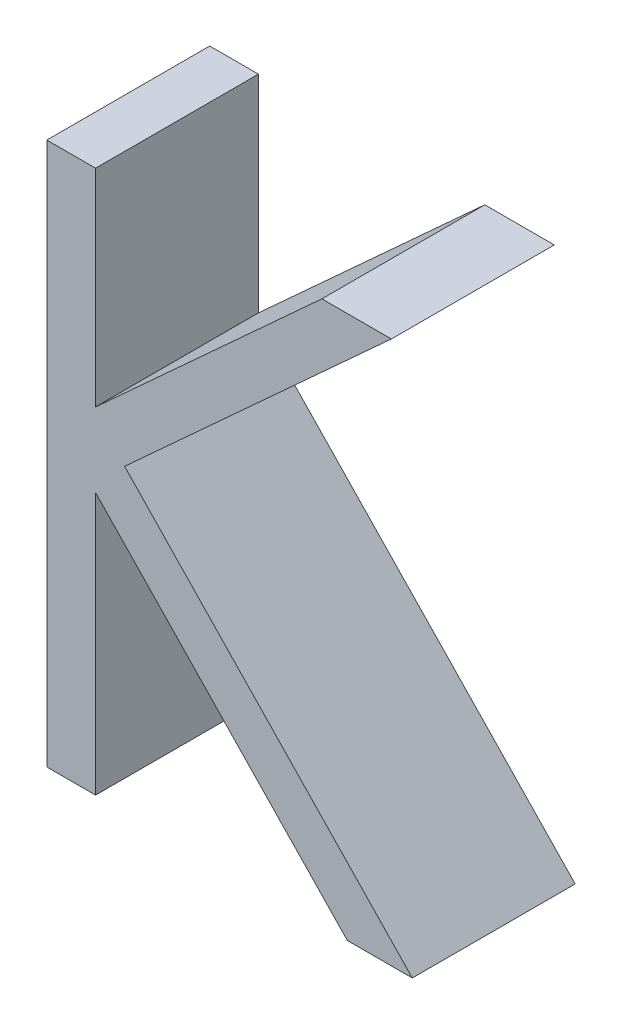
ISO-10303-21;
HEADER;
FILE_DESCRIPTION(('STEP AP214'),'2;1');
FILE_NAME('part.step','',(''),(''),'','','');
FILE_SCHEMA(('AUTOMOTIVE_DESIGN { 1 0 10303 214 1 1 1 1 }'));
ENDSEC;
DATA;
#1=APPLICATION_CONTEXT('core data for automotive mechanical design processes');
#2=APPLICATION_PROTOCOL_DEFINITION('international standard','automotive_design',2000,#1);
#3=PRODUCT_CONTEXT('',#1,'mechanical');
#4=PRODUCT('Part','Part','',(#3));
#5=PRODUCT_RELATED_PRODUCT_CATEGORY('part','',(#4));
#6=PRODUCT_DEFINITION_FORMATION('','',#4);
#7=PRODUCT_DEFINITION_CONTEXT('part definition',#1,'design');
#8=PRODUCT_DEFINITION('design','',#6,#7);
#9=PRODUCT_DEFINITION_SHAPE('','',#8);
#10=(LENGTH_UNIT() NAMED_UNIT(*) SI_UNIT(.MILLI.,.METRE.));
#11=(NAMED_UNIT(*) PLANE_ANGLE_UNIT() SI_UNIT($,.RADIAN.));
#12=(NAMED_UNIT(*) SI_UNIT($,.STERADIAN.) SOLID_ANGLE_UNIT());
#13=UNCERTAINTY_MEASURE_WITH_UNIT(LENGTH_MEASURE(1.E-05),#10,'distance_accuracy_value','');
#14=(GEOMETRIC_REPRESENTATION_CONTEXT(3) GLOBAL_UNCERTAINTY_ASSIGNED_CONTEXT((#13)) GLOBAL_UNIT_ASSIGNED_CONTEXT((#10,
#11,#12)) REPRESENTATION_CONTEXT('',''));
#15=CARTESIAN_POINT('',(0.,0.,0.));
#16=DIRECTION('',(0.,0.,1.));
#17=DIRECTION('',(1.,0.,0.));
#18=AXIS2_PLACEMENT_3D('',#15,#16,#17);
#19=CARTESIAN_POINT('',(-55.4324653258695,-22.8701190762308,1.5));
#20=DIRECTION('',(-1.,0.,0.));
#21=DIRECTION('',(0.,0.,1.));
#22=AXIS2_PLACEMENT_3D('',#19,#20,#21);
#23=PLANE('',#22);
#24=DIRECTION('',(0.,1.,0.));
#25=VECTOR('',#24,1.);
#26=CARTESIAN_POINT('',(-55.4324653258695,-22.8701190762308,0.));
#27=LINE('',#26,#25);
#28=CARTESIAN_POINT('',(-55.4324653258695,-22.8701190762308,0.));
#29=VERTEX_POINT('',#28);
#30=CARTESIAN_POINT('',(-55.4324653258695,-17.8701190762308,0.));
#31=VERTEX_POINT('',#30);
#32=EDGE_CURVE('E148',#29,#31,#27,.T.);
#33=ORIENTED_EDGE('',*,*,#32,.F.);
#34=DIRECTION('',(0.,0.,-1.));
#35=VECTOR('',#34,1.);
#36=CARTESIAN_POINT('',(-55.4324653258695,-22.8701190762308,1.5));
#37=LINE('',#36,#35);
#38=CARTESIAN_POINT('',(-55.4324653258695,-22.8701190762308,1.5));
#39=VERTEX_POINT('',#38);
#40=EDGE_CURVE('E11',#39,#29,#37,.T.);
#41=ORIENTED_EDGE('',*,*,#40,.F.);
#42=DIRECTION('',(0.,1.,0.));
#43=VECTOR('',#42,1.);
#44=CARTESIAN_POINT('',(-55.4324653258695,-22.8701190762308,1.5));
#45=LINE('',#44,#43);
#46=CARTESIAN_POINT('',(-55.4324653258695,-17.8701190762308,1.5));
#47=VERTEX_POINT('',#46);
#48=EDGE_CURVE('E177',#39,#47,#45,.T.);
#49=ORIENTED_EDGE('',*,*,#48,.T.);
#50=DIRECTION('',(0.,0.,-1.));
#51=VECTOR('',#50,1.);
#52=CARTESIAN_POINT('',(-55.4324653258695,-17.8701190762308,1.5));
#53=LINE('',#52,#51);
#54=EDGE_CURVE('E36',#47,#31,#53,.T.);
#55=ORIENTED_EDGE('',*,*,#54,.T.);
#56=EDGE_LOOP('',(#33,#41,#49,#55));
#57=FACE_BOUND('',#56,.T.);
#58=ADVANCED_FACE('F33',(#57),#23,.T.);
#59=CARTESIAN_POINT('',(-54.9837473771516,-22.8701190762308,1.5));
#60=DIRECTION('',(0.,-1.,0.));
#61=DIRECTION('',(0.,0.,-1.));
#62=AXIS2_PLACEMENT_3D('',#59,#60,#61);
#63=PLANE('',#62);
#64=DIRECTION('',(-1.,0.,0.));
#65=VECTOR('',#64,1.);
#66=CARTESIAN_POINT('',(-54.9837473771516,-22.8701190762308,0.));
#67=LINE('',#66,#65);
#68=CARTESIAN_POINT('',(-54.9837473771516,-22.8701190762308,0.));
#69=VERTEX_POINT('',#68);
#70=EDGE_CURVE('E175',#69,#29,#67,.T.);
#71=ORIENTED_EDGE('',*,*,#70,.F.);
#72=DIRECTION('',(0.,0.,-1.));
#73=VECTOR('',#72,1.);
#74=CARTESIAN_POINT('',(-54.9837473771516,-22.8701190762308,1.5));
#75=LINE('',#74,#73);
#76=CARTESIAN_POINT('',(-54.9837473771516,-22.8701190762308,1.5));
#77=VERTEX_POINT('',#76);
#78=EDGE_CURVE('E42',#77,#69,#75,.T.);
#79=ORIENTED_EDGE('',*,*,#78,.F.);
#80=DIRECTION('',(-1.,0.,0.));
#81=VECTOR('',#80,1.);
#82=CARTESIAN_POINT('',(-54.9837473771516,-22.8701190762308,1.5));
#83=LINE('',#82,#81);
#84=EDGE_CURVE('E138',#77,#39,#83,.T.);
#85=ORIENTED_EDGE('',*,*,#84,.T.);
#86=ORIENTED_EDGE('',*,*,#40,.T.);
#87=EDGE_LOOP('',(#71,#79,#85,#86));
#88=FACE_BOUND('',#87,.T.);
#89=ADVANCED_FACE('F195',(#88),#63,.T.);
#90=CARTESIAN_POINT('',(-54.9837473771516,-20.4572584993077,1.5));
#91=DIRECTION('',(1.,0.,0.));
#92=DIRECTION('',(0.,0.,-1.));
#93=AXIS2_PLACEMENT_3D('',#90,#91,#92);
#94=PLANE('',#93);
#95=DIRECTION('',(0.,-1.,0.));
#96=VECTOR('',#95,1.);
#97=CARTESIAN_POINT('',(-54.9837473771516,-20.4572584993077,0.));
#98=LINE('',#97,#96);
#99=CARTESIAN_POINT('',(-54.9837473771516,-20.4572584993077,0.));
#100=VERTEX_POINT('',#99);
#101=EDGE_CURVE('E125',#100,#69,#98,.T.);
#102=ORIENTED_EDGE('',*,*,#101,.F.);
#103=DIRECTION('',(0.,0.,-1.));
#104=VECTOR('',#103,1.);
#105=CARTESIAN_POINT('',(-54.9837473771516,-20.4572584993077,1.5));
#106=LINE('',#105,#104);
#107=CARTESIAN_POINT('',(-54.9837473771516,-20.4572584993077,1.5));
#108=VERTEX_POINT('',#107);
#109=EDGE_CURVE('E120',#108,#100,#106,.T.);
#110=ORIENTED_EDGE('',*,*,#109,.F.);
#111=DIRECTION('',(0.,-1.,0.));
#112=VECTOR('',#111,1.);
#113=CARTESIAN_POINT('',(-54.9837473771516,-20.4572584993077,1.5));
#114=LINE('',#113,#112);
#115=EDGE_CURVE('E123',#108,#77,#114,.T.);
#116=ORIENTED_EDGE('',*,*,#115,.T.);
#117=ORIENTED_EDGE('',*,*,#78,.T.);
#118=EDGE_LOOP('',(#102,#110,#116,#117));
#119=FACE_BOUND('',#118,.T.);
#120=ADVANCED_FACE('F122',(#119),#94,.T.);
#121=CARTESIAN_POINT('',(-52.6650374412542,-22.8701190762308,1.5));
#122=DIRECTION('',(-0.721034337340712,-0.692899332064651,0.));
#123=DIRECTION('',(0.692899332064651,-0.721034337340712,0.));
#124=AXIS2_PLACEMENT_3D('',#121,#122,#123);
#125=PLANE('',#124);
#126=DIRECTION('',(-0.692899332064651,0.721034337340712,0.));
#127=VECTOR('',#126,1.);
#128=CARTESIAN_POINT('',(-52.6650374412542,-22.8701190762308,0.));
#129=LINE('',#128,#127);
#130=CARTESIAN_POINT('',(-52.6650374412542,-22.8701190762308,0.));
#131=VERTEX_POINT('',#130);
#132=EDGE_CURVE('E172',#131,#100,#129,.T.);
#133=ORIENTED_EDGE('',*,*,#132,.F.);
#134=DIRECTION('',(0.,0.,-1.));
#135=VECTOR('',#134,1.);
#136=CARTESIAN_POINT('',(-52.6650374412542,-22.8701190762308,1.5));
#137=LINE('',#136,#135);
#138=CARTESIAN_POINT('',(-52.6650374412542,-22.8701190762308,1.5));
#139=VERTEX_POINT('',#138);
#140=EDGE_CURVE('E130',#139,#131,#137,.T.);
#141=ORIENTED_EDGE('',*,*,#140,.F.);
#142=DIRECTION('',(-0.692899332064651,0.721034337340712,0.));
#143=VECTOR('',#142,1.);
#144=CARTESIAN_POINT('',(-52.6650374412542,-22.8701190762308,1.5));
#145=LINE('',#144,#143);
#146=EDGE_CURVE('E136',#139,#108,#145,.T.);
#147=ORIENTED_EDGE('',*,*,#146,.T.);
#148=ORIENTED_EDGE('',*,*,#109,.T.);
#149=EDGE_LOOP('',(#133,#141,#147,#148));
#150=FACE_BOUND('',#149,.T.);
#151=ADVANCED_FACE('F140',(#150),#125,.T.);
#152=CARTESIAN_POINT('',(-52.0670807104849,-22.8701190762308,1.5));
#153=DIRECTION('',(0.,-1.,0.));
#154=DIRECTION('',(0.,0.,-1.));
#155=AXIS2_PLACEMENT_3D('',#152,#153,#154);
#156=PLANE('',#155);
#157=DIRECTION('',(-1.,0.,0.));
#158=VECTOR('',#157,1.);
#159=CARTESIAN_POINT('',(-52.0670807104849,-22.8701190762308,0.));
#160=LINE('',#159,#158);
#161=CARTESIAN_POINT('',(-52.0670807104849,-22.8701190762308,0.));
#162=VERTEX_POINT('',#161);
#163=EDGE_CURVE('E169',#162,#131,#160,.T.);
#164=ORIENTED_EDGE('',*,*,#163,.F.);
#165=DIRECTION('',(0.,0.,-1.));
#166=VECTOR('',#165,1.);
#167=CARTESIAN_POINT('',(-52.0670807104849,-22.8701190762308,1.5));
#168=LINE('',#167,#166);
#169=CARTESIAN_POINT('',(-52.0670807104849,-22.8701190762308,1.5));
#170=VERTEX_POINT('',#169);
#171=EDGE_CURVE('E181',#170,#162,#168,.T.);
#172=ORIENTED_EDGE('',*,*,#171,.F.);
#173=DIRECTION('',(-1.,0.,0.));
#174=VECTOR('',#173,1.);
#175=CARTESIAN_POINT('',(-52.0670807104849,-22.8701190762308,1.5));
#176=LINE('',#175,#174);
#177=EDGE_CURVE('E141',#170,#139,#176,.T.);
#178=ORIENTED_EDGE('',*,*,#177,.T.);
#179=ORIENTED_EDGE('',*,*,#140,.T.);
#180=EDGE_LOOP('',(#164,#172,#178,#179));
#181=FACE_BOUND('',#180,.T.);
#182=ADVANCED_FACE('F208',(#181),#156,.T.);
#183=CARTESIAN_POINT('',(-54.7163194925362,-20.1137088198206,1.5));
#184=DIRECTION('',(0.720984077089344,0.692951629324607,0.));
#185=DIRECTION('',(-0.692951629324607,0.720984077089344,0.));
#186=AXIS2_PLACEMENT_3D('',#183,#184,#185);
#187=PLANE('',#186);
#188=DIRECTION('',(0.692951629324606,-0.720984077089344,0.));
#189=VECTOR('',#188,1.);
#190=CARTESIAN_POINT('',(-54.7163194925362,-20.1137088198206,0.));
#191=LINE('',#190,#189);
#192=CARTESIAN_POINT('',(-54.7163194925362,-20.1137088198206,0.));
#193=VERTEX_POINT('',#192);
#194=EDGE_CURVE('E166',#193,#162,#191,.T.);
#195=ORIENTED_EDGE('',*,*,#194,.F.);
#196=DIRECTION('',(0.,0.,-1.));
#197=VECTOR('',#196,1.);
#198=CARTESIAN_POINT('',(-54.7163194925362,-20.1137088198206,1.5));
#199=LINE('',#198,#197);
#200=CARTESIAN_POINT('',(-54.7163194925362,-20.1137088198206,1.5));
#201=VERTEX_POINT('',#200);
#202=EDGE_CURVE('E183',#201,#193,#199,.T.);
#203=ORIENTED_EDGE('',*,*,#202,.F.);
#204=DIRECTION('',(0.692951629324606,-0.720984077089344,0.));
#205=VECTOR('',#204,1.);
#206=CARTESIAN_POINT('',(-54.7163194925362,-20.1137088198206,1.5));
#207=LINE('',#206,#205);
#208=EDGE_CURVE('E143',#201,#170,#207,.T.);
#209=ORIENTED_EDGE('',*,*,#208,.T.);
#210=ORIENTED_EDGE('',*,*,#171,.T.);
#211=EDGE_LOOP('',(#195,#203,#209,#210));
#212=FACE_BOUND('',#211,.T.);
#213=ADVANCED_FACE('F211',(#212),#187,.T.);
#214=CARTESIAN_POINT('',(-52.2593884027926,-17.8701190762308,1.5));
#215=DIRECTION('',(0.674319328149855,-0.738439871406961,0.));
#216=DIRECTION('',(0.738439871406961,0.674319328149855,0.));
#217=AXIS2_PLACEMENT_3D('',#214,#215,#216);
#218=PLANE('',#217);
#219=DIRECTION('',(-0.738439871406961,-0.674319328149855,0.));
#220=VECTOR('',#219,1.);
#221=CARTESIAN_POINT('',(-52.2593884027926,-17.8701190762308,0.));
#222=LINE('',#221,#220);
#223=CARTESIAN_POINT('',(-52.2593884027926,-17.8701190762308,0.));
#224=VERTEX_POINT('',#223);
#225=EDGE_CURVE('E163',#224,#193,#222,.T.);
#226=ORIENTED_EDGE('',*,*,#225,.F.);
#227=DIRECTION('',(0.,0.,-1.));
#228=VECTOR('',#227,1.);
#229=CARTESIAN_POINT('',(-52.2593884027926,-17.8701190762308,1.5));
#230=LINE('',#229,#228);
#231=CARTESIAN_POINT('',(-52.2593884027926,-17.8701190762308,1.5));
#232=VERTEX_POINT('',#231);
#233=EDGE_CURVE('E185',#232,#224,#230,.T.);
#234=ORIENTED_EDGE('',*,*,#233,.F.);
#235=DIRECTION('',(-0.738439871406961,-0.674319328149855,0.));
#236=VECTOR('',#235,1.);
#237=CARTESIAN_POINT('',(-52.2593884027926,-17.8701190762308,1.5));
#238=LINE('',#237,#236);
#239=EDGE_CURVE('E345',#232,#201,#238,.T.);
#240=ORIENTED_EDGE('',*,*,#239,.T.);
#241=ORIENTED_EDGE('',*,*,#202,.T.);
#242=EDGE_LOOP('',(#226,#234,#240,#241));
#243=FACE_BOUND('',#242,.T.);
#244=ADVANCED_FACE('F215',(#243),#218,.T.);
#245=CARTESIAN_POINT('',(-52.8994124412541,-17.8701190762308,1.5));
#246=DIRECTION('',(0.,1.,0.));
#247=DIRECTION('',(0.,0.,1.));
#248=AXIS2_PLACEMENT_3D('',#245,#246,#247);
#249=PLANE('',#248);
#250=DIRECTION('',(1.,0.,0.));
#251=VECTOR('',#250,1.);
#252=CARTESIAN_POINT('',(-52.8994124412541,-17.8701190762308,0.));
#253=LINE('',#252,#251);
#254=CARTESIAN_POINT('',(-52.8994124412541,-17.8701190762308,0.));
#255=VERTEX_POINT('',#254);
#256=EDGE_CURVE('E160',#255,#224,#253,.T.);
#257=ORIENTED_EDGE('',*,*,#256,.F.);
#258=DIRECTION('',(0.,0.,-1.));
#259=VECTOR('',#258,1.);
#260=CARTESIAN_POINT('',(-52.8994124412541,-17.8701190762308,1.5));
#261=LINE('',#260,#259);
#262=CARTESIAN_POINT('',(-52.8994124412541,-17.8701190762308,1.5));
#263=VERTEX_POINT('',#262);
#264=EDGE_CURVE('E187',#263,#255,#261,.T.);
#265=ORIENTED_EDGE('',*,*,#264,.F.);
#266=DIRECTION('',(1.,0.,0.));
#267=VECTOR('',#266,1.);
#268=CARTESIAN_POINT('',(-52.8994124412541,-17.8701190762308,1.5));
#269=LINE('',#268,#267);
#270=EDGE_CURVE('E338',#263,#232,#269,.T.);
#271=ORIENTED_EDGE('',*,*,#270,.T.);
#272=ORIENTED_EDGE('',*,*,#233,.T.);
#273=EDGE_LOOP('',(#257,#265,#271,#272));
#274=FACE_BOUND('',#273,.T.);
#275=ADVANCED_FACE('F219',(#274),#249,.T.);
#276=CARTESIAN_POINT('',(-54.9837473771516,-19.7741655505898,1.5));
#277=DIRECTION('',(-0.67445441849086,0.738316488626765,0.));
#278=DIRECTION('',(-0.738316488626765,-0.67445441849086,0.));
#279=AXIS2_PLACEMENT_3D('',#276,#277,#278);
#280=PLANE('',#279);
#281=DIRECTION('',(0.738316488626765,0.67445441849086,0.));
#282=VECTOR('',#281,1.);
#283=CARTESIAN_POINT('',(-54.9837473771516,-19.7741655505898,0.));
#284=LINE('',#283,#282);
#285=CARTESIAN_POINT('',(-54.9837473771516,-19.7741655505898,0.));
#286=VERTEX_POINT('',#285);
#287=EDGE_CURVE('E157',#286,#255,#284,.T.);
#288=ORIENTED_EDGE('',*,*,#287,.F.);
#289=DIRECTION('',(0.,0.,-1.));
#290=VECTOR('',#289,1.);
#291=CARTESIAN_POINT('',(-54.9837473771516,-19.7741655505898,1.5));
#292=LINE('',#291,#290);
#293=CARTESIAN_POINT('',(-54.9837473771516,-19.7741655505898,1.5));
#294=VERTEX_POINT('',#293);
#295=EDGE_CURVE('E189',#294,#286,#292,.T.);
#296=ORIENTED_EDGE('',*,*,#295,.F.);
#297=DIRECTION('',(0.738316488626765,0.67445441849086,0.));
#298=VECTOR('',#297,1.);
#299=CARTESIAN_POINT('',(-54.9837473771516,-19.7741655505898,1.5));
#300=LINE('',#299,#298);
#301=EDGE_CURVE('E334',#294,#263,#300,.T.);
#302=ORIENTED_EDGE('',*,*,#301,.T.);
#303=ORIENTED_EDGE('',*,*,#264,.T.);
#304=EDGE_LOOP('',(#288,#296,#302,#303));
#305=FACE_BOUND('',#304,.T.);
#306=ADVANCED_FACE('F223',(#305),#280,.T.);
#307=CARTESIAN_POINT('',(-54.9837473771516,-17.8701190762308,1.5));
#308=DIRECTION('',(1.,0.,0.));
#309=DIRECTION('',(0.,0.,-1.));
#310=AXIS2_PLACEMENT_3D('',#307,#308,#309);
#311=PLANE('',#310);
#312=DIRECTION('',(0.,-1.,0.));
#313=VECTOR('',#312,1.);
#314=CARTESIAN_POINT('',(-54.9837473771516,-17.8701190762308,0.));
#315=LINE('',#314,#313);
#316=CARTESIAN_POINT('',(-54.9837473771516,-17.8701190762308,0.));
#317=VERTEX_POINT('',#316);
#318=EDGE_CURVE('E154',#317,#286,#315,.T.);
#319=ORIENTED_EDGE('',*,*,#318,.F.);
#320=DIRECTION('',(0.,0.,-1.));
#321=VECTOR('',#320,1.);
#322=CARTESIAN_POINT('',(-54.9837473771516,-17.8701190762308,1.5));
#323=LINE('',#322,#321);
#324=CARTESIAN_POINT('',(-54.9837473771516,-17.8701190762308,1.5));
#325=VERTEX_POINT('',#324);
#326=EDGE_CURVE('E190',#325,#317,#323,.T.);
#327=ORIENTED_EDGE('',*,*,#326,.F.);
#328=DIRECTION('',(0.,-1.,0.));
#329=VECTOR('',#328,1.);
#330=CARTESIAN_POINT('',(-54.9837473771516,-17.8701190762308,1.5));
#331=LINE('',#330,#329);
#332=EDGE_CURVE('E350',#325,#294,#331,.T.);
#333=ORIENTED_EDGE('',*,*,#332,.T.);
#334=ORIENTED_EDGE('',*,*,#295,.T.);
#335=EDGE_LOOP('',(#319,#327,#333,#334));
#336=FACE_BOUND('',#335,.T.);
#337=ADVANCED_FACE('F227',(#336),#311,.T.);
#338=CARTESIAN_POINT('',(-55.4324653258695,-17.8701190762308,1.5));
#339=DIRECTION('',(0.,1.,0.));
#340=DIRECTION('',(0.,0.,1.));
#341=AXIS2_PLACEMENT_3D('',#338,#339,#340);
#342=PLANE('',#341);
#343=DIRECTION('',(1.,0.,0.));
#344=VECTOR('',#343,1.);
#345=CARTESIAN_POINT('',(-55.4324653258695,-17.8701190762308,0.));
#346=LINE('',#345,#344);
#347=EDGE_CURVE('E151',#31,#317,#346,.T.);
#348=ORIENTED_EDGE('',*,*,#347,.F.);
#349=ORIENTED_EDGE('',*,*,#54,.F.);
#350=DIRECTION('',(1.,0.,0.));
#351=VECTOR('',#350,1.);
#352=CARTESIAN_POINT('',(-55.4324653258695,-17.8701190762308,1.5));
#353=LINE('',#352,#351);
#354=EDGE_CURVE('E352',#47,#325,#353,.T.);
#355=ORIENTED_EDGE('',*,*,#354,.T.);
#356=ORIENTED_EDGE('',*,*,#326,.T.);
#357=EDGE_LOOP('',(#348,#349,#355,#356));
#358=FACE_BOUND('',#357,.T.);
#359=ADVANCED_FACE('F192',(#358),#342,.T.);
#360=CARTESIAN_POINT('',(0.,0.,1.5));
#361=DIRECTION('',(0.,0.,-1.));
#362=DIRECTION('',(-1.,0.,0.));
#363=AXIS2_PLACEMENT_3D('',#360,#361,#362);
#364=PLANE('',#363);
#365=ORIENTED_EDGE('',*,*,#48,.F.);
#366=ORIENTED_EDGE('',*,*,#84,.F.);
#367=ORIENTED_EDGE('',*,*,#115,.F.);
#368=ORIENTED_EDGE('',*,*,#146,.F.);
#369=ORIENTED_EDGE('',*,*,#177,.F.);
#370=ORIENTED_EDGE('',*,*,#208,.F.);
#371=ORIENTED_EDGE('',*,*,#239,.F.);
#372=ORIENTED_EDGE('',*,*,#270,.F.);
#373=ORIENTED_EDGE('',*,*,#301,.F.);
#374=ORIENTED_EDGE('',*,*,#332,.F.);
#375=ORIENTED_EDGE('',*,*,#354,.F.);
#376=EDGE_LOOP('',(#365,#366,#367,#368,#369,#370,#371,#372,#373,#374,#375));
#377=FACE_BOUND('',#376,.T.);
#378=ADVANCED_FACE('F134',(#377),#364,.F.);
#379=CARTESIAN_POINT('',(0.,0.,0.));
#380=DIRECTION('',(0.,0.,-1.));
#381=DIRECTION('',(-1.,0.,0.));
#382=AXIS2_PLACEMENT_3D('',#379,#380,#381);
#383=PLANE('',#382);
#384=ORIENTED_EDGE('',*,*,#32,.T.);
#385=ORIENTED_EDGE('',*,*,#347,.T.);
#386=ORIENTED_EDGE('',*,*,#318,.T.);
#387=ORIENTED_EDGE('',*,*,#287,.T.);
#388=ORIENTED_EDGE('',*,*,#256,.T.);
#389=ORIENTED_EDGE('',*,*,#225,.T.);
#390=ORIENTED_EDGE('',*,*,#194,.T.);
#391=ORIENTED_EDGE('',*,*,#163,.T.);
#392=ORIENTED_EDGE('',*,*,#132,.T.);
#393=ORIENTED_EDGE('',*,*,#101,.T.);
#394=ORIENTED_EDGE('',*,*,#70,.T.);
#395=EDGE_LOOP('',(#384,#385,#386,#387,#388,#389,#390,#391,#392,#393,#394));
#396=FACE_BOUND('',#395,.T.);
#397=ADVANCED_FACE('F194',(#396),#383,.T.);
#398=CLOSED_SHELL('',(#58,#89,#120,#151,#182,#213,#244,#275,#306,#337,#359,#378,#397));
#399=MANIFOLD_SOLID_BREP('B2',#398);
#400=ADVANCED_BREP_SHAPE_REPRESENTATION('',(#18,#399),#14);
#401=SHAPE_DEFINITION_REPRESENTATION(#9,#400);
ENDSEC;
END-ISO-10303-21;
